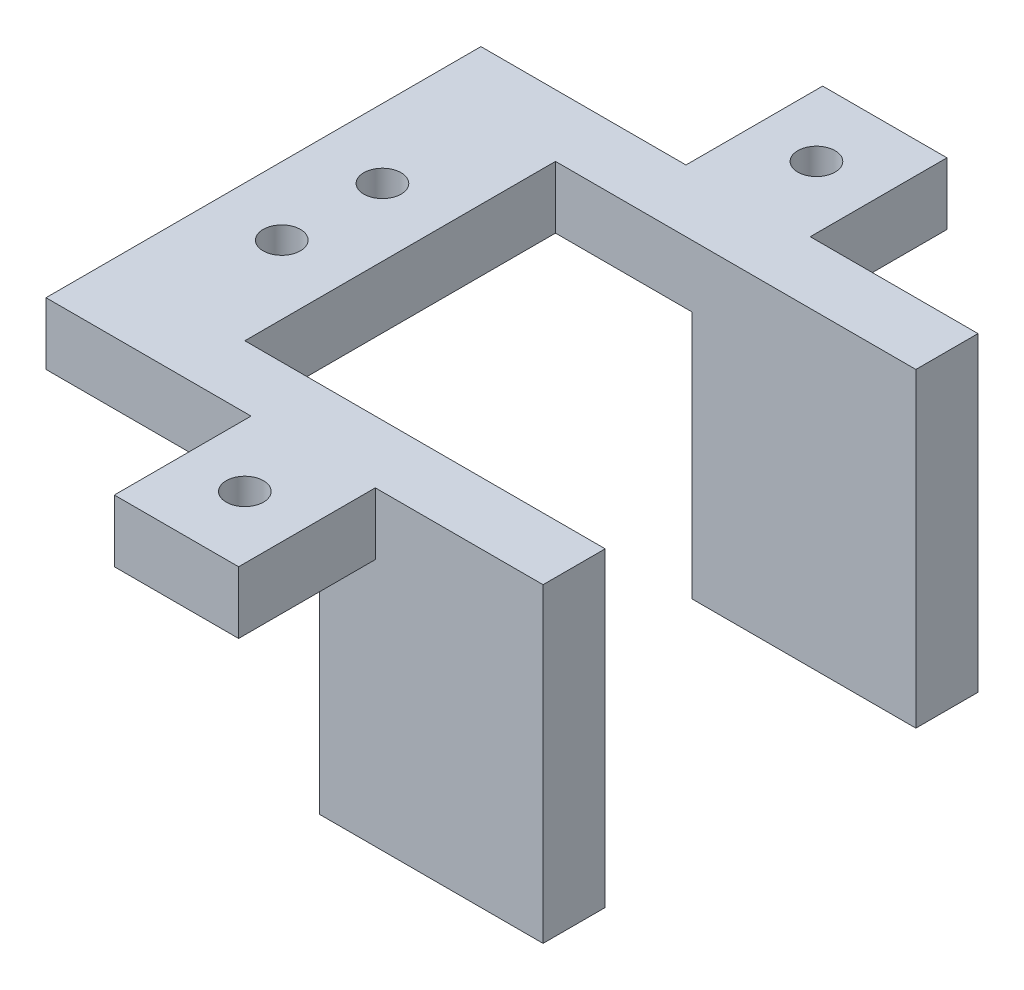
ISO-10303-21;
HEADER;
FILE_DESCRIPTION(('STEP AP214'),'2;1');
FILE_NAME('part.step','',(''),(''),'','','');
FILE_SCHEMA(('AUTOMOTIVE_DESIGN { 1 0 10303 214 1 1 1 1 }'));
ENDSEC;
DATA;
#1=APPLICATION_CONTEXT('core data for automotive mechanical design processes');
#2=APPLICATION_PROTOCOL_DEFINITION('international standard','automotive_design',2000,#1);
#3=PRODUCT_CONTEXT('',#1,'mechanical');
#4=PRODUCT('Part','Part','',(#3));
#5=PRODUCT_RELATED_PRODUCT_CATEGORY('part','',(#4));
#6=PRODUCT_DEFINITION_FORMATION('','',#4);
#7=PRODUCT_DEFINITION_CONTEXT('part definition',#1,'design');
#8=PRODUCT_DEFINITION('design','',#6,#7);
#9=PRODUCT_DEFINITION_SHAPE('','',#8);
#10=(LENGTH_UNIT() NAMED_UNIT(*) SI_UNIT(.MILLI.,.METRE.));
#11=(NAMED_UNIT(*) PLANE_ANGLE_UNIT() SI_UNIT($,.RADIAN.));
#12=(NAMED_UNIT(*) SI_UNIT($,.STERADIAN.) SOLID_ANGLE_UNIT());
#13=UNCERTAINTY_MEASURE_WITH_UNIT(LENGTH_MEASURE(1.E-05),#10,'distance_accuracy_value','');
#14=(GEOMETRIC_REPRESENTATION_CONTEXT(3) GLOBAL_UNCERTAINTY_ASSIGNED_CONTEXT((#13)) GLOBAL_UNIT_ASSIGNED_CONTEXT((#10,
#11,#12)) REPRESENTATION_CONTEXT('',''));
#15=CARTESIAN_POINT('',(0.,0.,0.));
#16=DIRECTION('',(0.,0.,1.));
#17=DIRECTION('',(1.,0.,0.));
#18=AXIS2_PLACEMENT_3D('',#15,#16,#17);
#19=CARTESIAN_POINT('',(0.,0.,-17.5));
#20=DIRECTION('',(0.,0.,-1.));
#21=DIRECTION('',(-1.,0.,0.));
#22=AXIS2_PLACEMENT_3D('',#19,#20,#21);
#23=PLANE('',#22);
#24=DIRECTION('',(-1.,0.,0.));
#25=VECTOR('',#24,1.);
#26=CARTESIAN_POINT('',(0.,0.,-17.5));
#27=LINE('',#26,#25);
#28=CARTESIAN_POINT('',(21.,0.,-17.5));
#29=VERTEX_POINT('',#28);
#30=CARTESIAN_POINT('',(16.5,0.,-17.5));
#31=VERTEX_POINT('',#30);
#32=EDGE_CURVE('E54',#29,#31,#27,.T.);
#33=ORIENTED_EDGE('',*,*,#32,.F.);
#34=DIRECTION('',(0.,-1.,0.));
#35=VECTOR('',#34,1.);
#36=CARTESIAN_POINT('',(21.,0.,-17.5));
#37=LINE('',#36,#35);
#38=CARTESIAN_POINT('',(21.,5.,-17.5));
#39=VERTEX_POINT('',#38);
#40=EDGE_CURVE('E196',#39,#29,#37,.T.);
#41=ORIENTED_EDGE('',*,*,#40,.F.);
#42=DIRECTION('',(1.,0.,0.));
#43=VECTOR('',#42,1.);
#44=CARTESIAN_POINT('',(-5.5,5.,-17.5));
#45=LINE('',#44,#43);
#46=CARTESIAN_POINT('',(34.5,5.,-17.5));
#47=VERTEX_POINT('',#46);
#48=EDGE_CURVE('E221',#39,#47,#45,.T.);
#49=ORIENTED_EDGE('',*,*,#48,.T.);
#50=DIRECTION('',(0.,-1.,0.));
#51=VECTOR('',#50,1.);
#52=CARTESIAN_POINT('',(34.5,5.,-17.5));
#53=LINE('',#52,#51);
#54=CARTESIAN_POINT('',(34.5,-20.,-17.5));
#55=VERTEX_POINT('',#54);
#56=EDGE_CURVE('E224',#47,#55,#53,.T.);
#57=ORIENTED_EDGE('',*,*,#56,.T.);
#58=DIRECTION('',(-1.,0.,0.));
#59=VECTOR('',#58,1.);
#60=CARTESIAN_POINT('',(34.5,-20.,-17.5));
#61=LINE('',#60,#59);
#62=CARTESIAN_POINT('',(16.5,-20.,-17.5));
#63=VERTEX_POINT('',#62);
#64=EDGE_CURVE('E227',#55,#63,#61,.T.);
#65=ORIENTED_EDGE('',*,*,#64,.T.);
#66=DIRECTION('',(0.,1.,0.));
#67=VECTOR('',#66,1.);
#68=CARTESIAN_POINT('',(16.5,-20.,-17.5));
#69=LINE('',#68,#67);
#70=EDGE_CURVE('E230',#63,#31,#69,.T.);
#71=ORIENTED_EDGE('',*,*,#70,.T.);
#72=EDGE_LOOP('',(#33,#41,#49,#57,#65,#71));
#73=FACE_BOUND('',#72,.T.);
#74=ADVANCED_FACE('F37',(#73),#23,.T.);
#75=CARTESIAN_POINT('',(16.5,-20.,-8.5));
#76=DIRECTION('',(1.,0.,0.));
#77=DIRECTION('',(0.,0.,-1.));
#78=AXIS2_PLACEMENT_3D('',#75,#76,#77);
#79=PLANE('',#78);
#80=DIRECTION('',(0.,-1.,0.));
#81=VECTOR('',#80,1.);
#82=CARTESIAN_POINT('',(16.5,0.,-12.5));
#83=LINE('',#82,#81);
#84=CARTESIAN_POINT('',(16.5,0.,-12.5));
#85=VERTEX_POINT('',#84);
#86=CARTESIAN_POINT('',(16.5,-20.,-12.5));
#87=VERTEX_POINT('',#86);
#88=EDGE_CURVE('E215',#85,#87,#83,.T.);
#89=ORIENTED_EDGE('',*,*,#88,.F.);
#90=DIRECTION('',(0.,0.,-1.));
#91=VECTOR('',#90,1.);
#92=CARTESIAN_POINT('',(16.5,0.,-8.5));
#93=LINE('',#92,#91);
#94=EDGE_CURVE('E320',#85,#31,#93,.T.);
#95=ORIENTED_EDGE('',*,*,#94,.T.);
#96=ORIENTED_EDGE('',*,*,#70,.F.);
#97=DIRECTION('',(0.,0.,-1.));
#98=VECTOR('',#97,1.);
#99=CARTESIAN_POINT('',(16.5,-20.,-8.5));
#100=LINE('',#99,#98);
#101=EDGE_CURVE('E322',#87,#63,#100,.T.);
#102=ORIENTED_EDGE('',*,*,#101,.F.);
#103=EDGE_LOOP('',(#89,#95,#96,#102));
#104=FACE_BOUND('',#103,.T.);
#105=ADVANCED_FACE('F364',(#104),#79,.F.);
#106=CARTESIAN_POINT('',(0.,-20.,0.));
#107=DIRECTION('',(0.,-1.,0.));
#108=DIRECTION('',(0.,0.,-1.));
#109=AXIS2_PLACEMENT_3D('',#106,#107,#108);
#110=PLANE('',#109);
#111=DIRECTION('',(0.,0.,-1.));
#112=VECTOR('',#111,1.);
#113=CARTESIAN_POINT('',(34.5,-20.,-8.5));
#114=LINE('',#113,#112);
#115=CARTESIAN_POINT('',(34.5,-20.,-12.5));
#116=VERTEX_POINT('',#115);
#117=EDGE_CURVE('E313',#116,#55,#114,.T.);
#118=ORIENTED_EDGE('',*,*,#117,.F.);
#119=DIRECTION('',(1.,0.,0.));
#120=VECTOR('',#119,1.);
#121=CARTESIAN_POINT('',(16.5,-20.,-12.5));
#122=LINE('',#121,#120);
#123=EDGE_CURVE('E217',#87,#116,#122,.T.);
#124=ORIENTED_EDGE('',*,*,#123,.F.);
#125=ORIENTED_EDGE('',*,*,#101,.T.);
#126=ORIENTED_EDGE('',*,*,#64,.F.);
#127=EDGE_LOOP('',(#118,#124,#125,#126));
#128=FACE_BOUND('',#127,.T.);
#129=ADVANCED_FACE('F370',(#128),#110,.T.);
#130=CARTESIAN_POINT('',(34.5,-20.,-8.5));
#131=DIRECTION('',(1.,0.,0.));
#132=DIRECTION('',(0.,0.,-1.));
#133=AXIS2_PLACEMENT_3D('',#130,#131,#132);
#134=PLANE('',#133);
#135=DIRECTION('',(0.,0.,-1.));
#136=VECTOR('',#135,1.);
#137=CARTESIAN_POINT('',(34.5,5.,-8.5));
#138=LINE('',#137,#136);
#139=CARTESIAN_POINT('',(34.5,5.,-12.5));
#140=VERTEX_POINT('',#139);
#141=EDGE_CURVE('E312',#140,#47,#138,.T.);
#142=ORIENTED_EDGE('',*,*,#141,.F.);
#143=DIRECTION('',(0.,1.,0.));
#144=VECTOR('',#143,1.);
#145=CARTESIAN_POINT('',(34.5,-20.,-12.5));
#146=LINE('',#145,#144);
#147=EDGE_CURVE('E219',#116,#140,#146,.T.);
#148=ORIENTED_EDGE('',*,*,#147,.F.);
#149=ORIENTED_EDGE('',*,*,#117,.T.);
#150=ORIENTED_EDGE('',*,*,#56,.F.);
#151=EDGE_LOOP('',(#142,#148,#149,#150));
#152=FACE_BOUND('',#151,.T.);
#153=ADVANCED_FACE('F378',(#152),#134,.T.);
#154=CARTESIAN_POINT('',(0.,0.,17.5));
#155=DIRECTION('',(0.,0.,1.));
#156=DIRECTION('',(1.,0.,0.));
#157=AXIS2_PLACEMENT_3D('',#154,#155,#156);
#158=PLANE('',#157);
#159=DIRECTION('',(0.,-1.,0.));
#160=VECTOR('',#159,1.);
#161=CARTESIAN_POINT('',(11.,0.,17.5));
#162=LINE('',#161,#160);
#163=CARTESIAN_POINT('',(11.,5.,17.5));
#164=VERTEX_POINT('',#163);
#165=CARTESIAN_POINT('',(11.,0.,17.5));
#166=VERTEX_POINT('',#165);
#167=EDGE_CURVE('E247',#164,#166,#162,.T.);
#168=ORIENTED_EDGE('',*,*,#167,.F.);
#169=DIRECTION('',(-1.,0.,0.));
#170=VECTOR('',#169,1.);
#171=CARTESIAN_POINT('',(34.5,5.,17.5));
#172=LINE('',#171,#170);
#173=CARTESIAN_POINT('',(-5.5,5.,17.5));
#174=VERTEX_POINT('',#173);
#175=EDGE_CURVE('E283',#164,#174,#172,.T.);
#176=ORIENTED_EDGE('',*,*,#175,.T.);
#177=DIRECTION('',(0.,-1.,0.));
#178=VECTOR('',#177,1.);
#179=CARTESIAN_POINT('',(-5.5,5.,17.5));
#180=LINE('',#179,#178);
#181=CARTESIAN_POINT('',(-5.5,0.,17.5));
#182=VERTEX_POINT('',#181);
#183=EDGE_CURVE('E286',#174,#182,#180,.T.);
#184=ORIENTED_EDGE('',*,*,#183,.T.);
#185=DIRECTION('',(1.,0.,0.));
#186=VECTOR('',#185,1.);
#187=CARTESIAN_POINT('',(-5.5,0.,17.5));
#188=LINE('',#187,#186);
#189=EDGE_CURVE('E289',#182,#166,#188,.T.);
#190=ORIENTED_EDGE('',*,*,#189,.T.);
#191=EDGE_LOOP('',(#168,#176,#184,#190));
#192=FACE_BOUND('',#191,.T.);
#193=ADVANCED_FACE('F417',(#192),#158,.T.);
#194=CARTESIAN_POINT('',(16.5,-20.,13.5));
#195=DIRECTION('',(1.,0.,0.));
#196=DIRECTION('',(0.,0.,-1.));
#197=AXIS2_PLACEMENT_3D('',#194,#195,#196);
#198=PLANE('',#197);
#199=DIRECTION('',(0.,1.,0.));
#200=VECTOR('',#199,1.);
#201=CARTESIAN_POINT('',(16.5,-20.,12.5));
#202=LINE('',#201,#200);
#203=CARTESIAN_POINT('',(16.5,-20.,12.5));
#204=VERTEX_POINT('',#203);
#205=CARTESIAN_POINT('',(16.5,0.,12.5));
#206=VERTEX_POINT('',#205);
#207=EDGE_CURVE('E275',#204,#206,#202,.T.);
#208=ORIENTED_EDGE('',*,*,#207,.F.);
#209=DIRECTION('',(0.,0.,-1.));
#210=VECTOR('',#209,1.);
#211=CARTESIAN_POINT('',(16.5,-20.,13.5));
#212=LINE('',#211,#210);
#213=CARTESIAN_POINT('',(16.5,-20.,17.5));
#214=VERTEX_POINT('',#213);
#215=EDGE_CURVE('E326',#214,#204,#212,.T.);
#216=ORIENTED_EDGE('',*,*,#215,.F.);
#217=DIRECTION('',(0.,-1.,0.));
#218=VECTOR('',#217,1.);
#219=CARTESIAN_POINT('',(16.5,0.,17.5));
#220=LINE('',#219,#218);
#221=CARTESIAN_POINT('',(16.5,0.,17.5));
#222=VERTEX_POINT('',#221);
#223=EDGE_CURVE('E291',#222,#214,#220,.T.);
#224=ORIENTED_EDGE('',*,*,#223,.F.);
#225=DIRECTION('',(0.,0.,-1.));
#226=VECTOR('',#225,1.);
#227=CARTESIAN_POINT('',(16.5,0.,13.5));
#228=LINE('',#227,#226);
#229=EDGE_CURVE('E324',#222,#206,#228,.T.);
#230=ORIENTED_EDGE('',*,*,#229,.T.);
#231=EDGE_LOOP('',(#208,#216,#224,#230));
#232=FACE_BOUND('',#231,.T.);
#233=ADVANCED_FACE('F401',(#232),#198,.F.);
#234=CARTESIAN_POINT('',(0.,-20.,0.));
#235=DIRECTION('',(0.,-1.,0.));
#236=DIRECTION('',(0.,0.,-1.));
#237=AXIS2_PLACEMENT_3D('',#234,#235,#236);
#238=PLANE('',#237);
#239=ORIENTED_EDGE('',*,*,#215,.T.);
#240=DIRECTION('',(-1.,0.,0.));
#241=VECTOR('',#240,1.);
#242=CARTESIAN_POINT('',(34.5,-20.,12.5));
#243=LINE('',#242,#241);
#244=CARTESIAN_POINT('',(34.5,-20.,12.5));
#245=VERTEX_POINT('',#244);
#246=EDGE_CURVE('E273',#245,#204,#243,.T.);
#247=ORIENTED_EDGE('',*,*,#246,.F.);
#248=DIRECTION('',(0.,0.,1.));
#249=VECTOR('',#248,1.);
#250=CARTESIAN_POINT('',(34.5,-20.,8.5));
#251=LINE('',#250,#249);
#252=CARTESIAN_POINT('',(34.5,-20.,17.5));
#253=VERTEX_POINT('',#252);
#254=EDGE_CURVE('E315',#245,#253,#251,.T.);
#255=ORIENTED_EDGE('',*,*,#254,.T.);
#256=DIRECTION('',(1.,0.,0.));
#257=VECTOR('',#256,1.);
#258=CARTESIAN_POINT('',(16.5,-20.,17.5));
#259=LINE('',#258,#257);
#260=EDGE_CURVE('E294',#214,#253,#259,.T.);
#261=ORIENTED_EDGE('',*,*,#260,.F.);
#262=EDGE_LOOP('',(#239,#247,#255,#261));
#263=FACE_BOUND('',#262,.T.);
#264=ADVANCED_FACE('F397',(#263),#238,.T.);
#265=CARTESIAN_POINT('',(34.5,-20.,8.5));
#266=DIRECTION('',(1.,0.,0.));
#267=DIRECTION('',(0.,0.,-1.));
#268=AXIS2_PLACEMENT_3D('',#265,#266,#267);
#269=PLANE('',#268);
#270=ORIENTED_EDGE('',*,*,#254,.F.);
#271=DIRECTION('',(0.,-1.,0.));
#272=VECTOR('',#271,1.);
#273=CARTESIAN_POINT('',(34.5,5.,12.5));
#274=LINE('',#273,#272);
#275=CARTESIAN_POINT('',(34.5,5.,12.5));
#276=VERTEX_POINT('',#275);
#277=EDGE_CURVE('E271',#276,#245,#274,.T.);
#278=ORIENTED_EDGE('',*,*,#277,.F.);
#279=DIRECTION('',(0.,0.,1.));
#280=VECTOR('',#279,1.);
#281=CARTESIAN_POINT('',(34.5,5.,8.5));
#282=LINE('',#281,#280);
#283=CARTESIAN_POINT('',(34.5,5.,17.5));
#284=VERTEX_POINT('',#283);
#285=EDGE_CURVE('E318',#276,#284,#282,.T.);
#286=ORIENTED_EDGE('',*,*,#285,.T.);
#287=DIRECTION('',(0.,1.,0.));
#288=VECTOR('',#287,1.);
#289=CARTESIAN_POINT('',(34.5,-20.,17.5));
#290=LINE('',#289,#288);
#291=EDGE_CURVE('E297',#253,#284,#290,.T.);
#292=ORIENTED_EDGE('',*,*,#291,.F.);
#293=EDGE_LOOP('',(#270,#278,#286,#292));
#294=FACE_BOUND('',#293,.T.);
#295=ADVANCED_FACE('F391',(#294),#269,.T.);
#296=CARTESIAN_POINT('',(0.,0.,0.));
#297=DIRECTION('',(0.,1.,0.));
#298=DIRECTION('',(0.,0.,1.));
#299=AXIS2_PLACEMENT_3D('',#296,#297,#298);
#300=PLANE('',#299);
#301=CARTESIAN_POINT('',(16.,0.,-23.));
#302=DIRECTION('',(0.,1.,0.));
#303=DIRECTION('',(0.,0.,1.));
#304=AXIS2_PLACEMENT_3D('',#301,#302,#303);
#305=CIRCLE('',#304,1.5);
#306=CARTESIAN_POINT('',(16.,0.,-21.5));
#307=VERTEX_POINT('',#306);
#308=EDGE_CURVE('E355',#307,#307,#305,.T.);
#309=ORIENTED_EDGE('',*,*,#308,.T.);
#310=EDGE_LOOP('',(#309));
#311=FACE_BOUND('',#310,.T.);
#312=CARTESIAN_POINT('',(16.,0.,23.));
#313=DIRECTION('',(0.,1.,0.));
#314=DIRECTION('',(0.,0.,1.));
#315=AXIS2_PLACEMENT_3D('',#312,#313,#314);
#316=CIRCLE('',#315,1.5);
#317=CARTESIAN_POINT('',(16.,0.,24.5));
#318=VERTEX_POINT('',#317);
#319=EDGE_CURVE('E239',#318,#318,#316,.T.);
#320=ORIENTED_EDGE('',*,*,#319,.T.);
#321=EDGE_LOOP('',(#320));
#322=FACE_BOUND('',#321,.T.);
#323=CARTESIAN_POINT('',(-0.0268741303224965,0.,4.00024075894849));
#324=DIRECTION('',(0.,1.,0.));
#325=DIRECTION('',(0.,0.,1.));
#326=AXIS2_PLACEMENT_3D('',#323,#324,#325);
#327=CIRCLE('',#326,1.5);
#328=CARTESIAN_POINT('',(-0.0268741303224965,0.,5.50024075894849));
#329=VERTEX_POINT('',#328);
#330=EDGE_CURVE('E309',#329,#329,#327,.T.);
#331=ORIENTED_EDGE('',*,*,#330,.T.);
#332=EDGE_LOOP('',(#331));
#333=FACE_BOUND('',#332,.T.);
#334=CARTESIAN_POINT('',(0.0725231157101173,0.,-4.00175422654102));
#335=DIRECTION('',(0.,1.,0.));
#336=DIRECTION('',(0.,0.,1.));
#337=AXIS2_PLACEMENT_3D('',#334,#335,#336);
#338=CIRCLE('',#337,1.5);
#339=CARTESIAN_POINT('',(0.0725231157101173,0.,-2.50175422654102));
#340=VERTEX_POINT('',#339);
#341=EDGE_CURVE('E304',#340,#340,#338,.T.);
#342=ORIENTED_EDGE('',*,*,#341,.T.);
#343=EDGE_LOOP('',(#342));
#344=FACE_BOUND('',#343,.T.);
#345=DIRECTION('',(1.,0.,0.));
#346=VECTOR('',#345,1.);
#347=CARTESIAN_POINT('',(5.5,0.,-12.5));
#348=LINE('',#347,#346);
#349=CARTESIAN_POINT('',(5.5,0.,-12.5));
#350=VERTEX_POINT('',#349);
#351=EDGE_CURVE('E213',#350,#85,#348,.T.);
#352=ORIENTED_EDGE('',*,*,#351,.F.);
#353=DIRECTION('',(0.,0.,1.));
#354=VECTOR('',#353,1.);
#355=CARTESIAN_POINT('',(5.5,0.,-8.5));
#356=LINE('',#355,#354);
#357=CARTESIAN_POINT('',(5.5,0.,12.5));
#358=VERTEX_POINT('',#357);
#359=EDGE_CURVE('E329',#350,#358,#356,.T.);
#360=ORIENTED_EDGE('',*,*,#359,.T.);
#361=DIRECTION('',(-1.,0.,0.));
#362=VECTOR('',#361,1.);
#363=CARTESIAN_POINT('',(16.5,0.,12.5));
#364=LINE('',#363,#362);
#365=EDGE_CURVE('E277',#206,#358,#364,.T.);
#366=ORIENTED_EDGE('',*,*,#365,.F.);
#367=ORIENTED_EDGE('',*,*,#229,.F.);
#368=DIRECTION('',(1.,0.,0.));
#369=VECTOR('',#368,1.);
#370=CARTESIAN_POINT('',(0.,0.,17.5));
#371=LINE('',#370,#369);
#372=CARTESIAN_POINT('',(21.,0.,17.5));
#373=VERTEX_POINT('',#372);
#374=EDGE_CURVE('E11',#222,#373,#371,.T.);
#375=ORIENTED_EDGE('',*,*,#374,.T.);
#376=DIRECTION('',(0.,0.,-1.));
#377=VECTOR('',#376,1.);
#378=CARTESIAN_POINT('',(21.,0.,28.5));
#379=LINE('',#378,#377);
#380=CARTESIAN_POINT('',(21.,0.,28.5));
#381=VERTEX_POINT('',#380);
#382=EDGE_CURVE('E266',#381,#373,#379,.T.);
#383=ORIENTED_EDGE('',*,*,#382,.F.);
#384=DIRECTION('',(1.,0.,0.));
#385=VECTOR('',#384,1.);
#386=CARTESIAN_POINT('',(0.,0.,28.5));
#387=LINE('',#386,#385);
#388=CARTESIAN_POINT('',(11.,0.,28.5));
#389=VERTEX_POINT('',#388);
#390=EDGE_CURVE('E243',#389,#381,#387,.T.);
#391=ORIENTED_EDGE('',*,*,#390,.F.);
#392=DIRECTION('',(0.,0.,-1.));
#393=VECTOR('',#392,1.);
#394=CARTESIAN_POINT('',(11.,0.,28.5));
#395=LINE('',#394,#393);
#396=EDGE_CURVE('E252',#389,#166,#395,.T.);
#397=ORIENTED_EDGE('',*,*,#396,.T.);
#398=ORIENTED_EDGE('',*,*,#189,.F.);
#399=DIRECTION('',(0.,0.,-1.));
#400=VECTOR('',#399,1.);
#401=CARTESIAN_POINT('',(-5.5,0.,3.));
#402=LINE('',#401,#400);
#403=CARTESIAN_POINT('',(-5.5,0.,-17.5));
#404=VERTEX_POINT('',#403);
#405=EDGE_CURVE('E41',#182,#404,#402,.T.);
#406=ORIENTED_EDGE('',*,*,#405,.T.);
#407=DIRECTION('',(-1.,0.,0.));
#408=VECTOR('',#407,1.);
#409=CARTESIAN_POINT('',(16.5,0.,-17.5));
#410=LINE('',#409,#408);
#411=CARTESIAN_POINT('',(11.,0.,-17.5));
#412=VERTEX_POINT('',#411);
#413=EDGE_CURVE('E201',#412,#404,#410,.T.);
#414=ORIENTED_EDGE('',*,*,#413,.F.);
#415=DIRECTION('',(0.,0.,1.));
#416=VECTOR('',#415,1.);
#417=CARTESIAN_POINT('',(11.,0.,-28.5));
#418=LINE('',#417,#416);
#419=CARTESIAN_POINT('',(11.,0.,-28.5));
#420=VERTEX_POINT('',#419);
#421=EDGE_CURVE('E181',#420,#412,#418,.T.);
#422=ORIENTED_EDGE('',*,*,#421,.F.);
#423=DIRECTION('',(-1.,0.,0.));
#424=VECTOR('',#423,1.);
#425=CARTESIAN_POINT('',(0.,0.,-28.5));
#426=LINE('',#425,#424);
#427=CARTESIAN_POINT('',(21.,0.,-28.5));
#428=VERTEX_POINT('',#427);
#429=EDGE_CURVE('E187',#428,#420,#426,.T.);
#430=ORIENTED_EDGE('',*,*,#429,.F.);
#431=DIRECTION('',(0.,0.,1.));
#432=VECTOR('',#431,1.);
#433=CARTESIAN_POINT('',(21.,0.,-28.5));
#434=LINE('',#433,#432);
#435=EDGE_CURVE('E351',#428,#29,#434,.T.);
#436=ORIENTED_EDGE('',*,*,#435,.T.);
#437=ORIENTED_EDGE('',*,*,#32,.T.);
#438=ORIENTED_EDGE('',*,*,#94,.F.);
#439=EDGE_LOOP('',(#352,#360,#366,#367,#375,#383,#391,#397,#398,#406,#414,#422,#430,#436,#437,#438));
#440=FACE_BOUND('',#439,.T.);
#441=ADVANCED_FACE('F199',(#311,#322,#333,#344,#440),#300,.F.);
#442=CARTESIAN_POINT('',(5.5,5.,-8.5));
#443=DIRECTION('',(1.,0.,0.));
#444=DIRECTION('',(0.,0.,-1.));
#445=AXIS2_PLACEMENT_3D('',#442,#443,#444);
#446=PLANE('',#445);
#447=ORIENTED_EDGE('',*,*,#359,.F.);
#448=DIRECTION('',(0.,-1.,0.));
#449=VECTOR('',#448,1.);
#450=CARTESIAN_POINT('',(5.5,5.,-12.5));
#451=LINE('',#450,#449);
#452=CARTESIAN_POINT('',(5.5,5.,-12.5));
#453=VERTEX_POINT('',#452);
#454=EDGE_CURVE('E205',#453,#350,#451,.T.);
#455=ORIENTED_EDGE('',*,*,#454,.F.);
#456=DIRECTION('',(0.,0.,-1.));
#457=VECTOR('',#456,1.);
#458=CARTESIAN_POINT('',(5.5,5.,8.5));
#459=LINE('',#458,#457);
#460=CARTESIAN_POINT('',(5.5,5.,12.5));
#461=VERTEX_POINT('',#460);
#462=EDGE_CURVE('E46',#461,#453,#459,.T.);
#463=ORIENTED_EDGE('',*,*,#462,.F.);
#464=DIRECTION('',(0.,1.,0.));
#465=VECTOR('',#464,1.);
#466=CARTESIAN_POINT('',(5.5,0.,12.5));
#467=LINE('',#466,#465);
#468=EDGE_CURVE('E280',#358,#461,#467,.T.);
#469=ORIENTED_EDGE('',*,*,#468,.F.);
#470=EDGE_LOOP('',(#447,#455,#463,#469));
#471=FACE_BOUND('',#470,.T.);
#472=ADVANCED_FACE('F39',(#471),#446,.T.);
#473=CARTESIAN_POINT('',(-5.5,5.,3.));
#474=DIRECTION('',(-1.,0.,0.));
#475=DIRECTION('',(0.,0.,1.));
#476=AXIS2_PLACEMENT_3D('',#473,#474,#475);
#477=PLANE('',#476);
#478=ORIENTED_EDGE('',*,*,#405,.F.);
#479=ORIENTED_EDGE('',*,*,#183,.F.);
#480=DIRECTION('',(0.,0.,1.));
#481=VECTOR('',#480,1.);
#482=CARTESIAN_POINT('',(-5.5,5.,3.));
#483=LINE('',#482,#481);
#484=CARTESIAN_POINT('',(-5.5,5.,-17.5));
#485=VERTEX_POINT('',#484);
#486=EDGE_CURVE('E332',#485,#174,#483,.T.);
#487=ORIENTED_EDGE('',*,*,#486,.F.);
#488=DIRECTION('',(0.,1.,0.));
#489=VECTOR('',#488,1.);
#490=CARTESIAN_POINT('',(-5.5,0.,-17.5));
#491=LINE('',#490,#489);
#492=EDGE_CURVE('E233',#404,#485,#491,.T.);
#493=ORIENTED_EDGE('',*,*,#492,.F.);
#494=EDGE_LOOP('',(#478,#479,#487,#493));
#495=FACE_BOUND('',#494,.T.);
#496=ADVANCED_FACE('F340',(#495),#477,.T.);
#497=CARTESIAN_POINT('',(0.,5.,0.));
#498=DIRECTION('',(0.,1.,0.));
#499=DIRECTION('',(0.,0.,1.));
#500=AXIS2_PLACEMENT_3D('',#497,#498,#499);
#501=PLANE('',#500);
#502=CARTESIAN_POINT('',(16.,5.,-23.));
#503=DIRECTION('',(0.,1.,0.));
#504=DIRECTION('',(0.,0.,1.));
#505=AXIS2_PLACEMENT_3D('',#502,#503,#504);
#506=CIRCLE('',#505,1.5);
#507=CARTESIAN_POINT('',(16.,5.,-21.5));
#508=VERTEX_POINT('',#507);
#509=EDGE_CURVE('E800',#508,#508,#506,.T.);
#510=ORIENTED_EDGE('',*,*,#509,.F.);
#511=EDGE_LOOP('',(#510));
#512=FACE_BOUND('',#511,.T.);
#513=ORIENTED_EDGE('',*,*,#462,.T.);
#514=DIRECTION('',(-1.,0.,0.));
#515=VECTOR('',#514,1.);
#516=CARTESIAN_POINT('',(34.5,5.,-12.5));
#517=LINE('',#516,#515);
#518=EDGE_CURVE('E202',#140,#453,#517,.T.);
#519=ORIENTED_EDGE('',*,*,#518,.F.);
#520=ORIENTED_EDGE('',*,*,#141,.T.);
#521=ORIENTED_EDGE('',*,*,#48,.F.);
#522=DIRECTION('',(0.,0.,1.));
#523=VECTOR('',#522,1.);
#524=CARTESIAN_POINT('',(21.,5.,-28.5));
#525=LINE('',#524,#523);
#526=CARTESIAN_POINT('',(21.,5.,-28.5));
#527=VERTEX_POINT('',#526);
#528=EDGE_CURVE('E207',#527,#39,#525,.T.);
#529=ORIENTED_EDGE('',*,*,#528,.F.);
#530=DIRECTION('',(1.,0.,0.));
#531=VECTOR('',#530,1.);
#532=CARTESIAN_POINT('',(0.,5.,-28.5));
#533=LINE('',#532,#531);
#534=CARTESIAN_POINT('',(11.,5.,-28.5));
#535=VERTEX_POINT('',#534);
#536=EDGE_CURVE('E186',#535,#527,#533,.T.);
#537=ORIENTED_EDGE('',*,*,#536,.F.);
#538=DIRECTION('',(0.,0.,1.));
#539=VECTOR('',#538,1.);
#540=CARTESIAN_POINT('',(11.,5.,-28.5));
#541=LINE('',#540,#539);
#542=CARTESIAN_POINT('',(11.,5.,-17.5));
#543=VERTEX_POINT('',#542);
#544=EDGE_CURVE('E183',#535,#543,#541,.T.);
#545=ORIENTED_EDGE('',*,*,#544,.T.);
#546=EDGE_CURVE('E222',#485,#543,#45,.T.);
#547=ORIENTED_EDGE('',*,*,#546,.F.);
#548=ORIENTED_EDGE('',*,*,#486,.T.);
#549=ORIENTED_EDGE('',*,*,#175,.F.);
#550=DIRECTION('',(0.,0.,-1.));
#551=VECTOR('',#550,1.);
#552=CARTESIAN_POINT('',(11.,5.,28.5));
#553=LINE('',#552,#551);
#554=CARTESIAN_POINT('',(11.,5.,28.5));
#555=VERTEX_POINT('',#554);
#556=EDGE_CURVE('E260',#555,#164,#553,.T.);
#557=ORIENTED_EDGE('',*,*,#556,.F.);
#558=DIRECTION('',(-1.,0.,0.));
#559=VECTOR('',#558,1.);
#560=CARTESIAN_POINT('',(0.,5.,28.5));
#561=LINE('',#560,#559);
#562=CARTESIAN_POINT('',(21.,5.,28.5));
#563=VERTEX_POINT('',#562);
#564=EDGE_CURVE('E249',#563,#555,#561,.T.);
#565=ORIENTED_EDGE('',*,*,#564,.F.);
#566=DIRECTION('',(0.,0.,-1.));
#567=VECTOR('',#566,1.);
#568=CARTESIAN_POINT('',(21.,5.,28.5));
#569=LINE('',#568,#567);
#570=CARTESIAN_POINT('',(21.,5.,17.5));
#571=VERTEX_POINT('',#570);
#572=EDGE_CURVE('E263',#563,#571,#569,.T.);
#573=ORIENTED_EDGE('',*,*,#572,.T.);
#574=EDGE_CURVE('E284',#284,#571,#172,.T.);
#575=ORIENTED_EDGE('',*,*,#574,.F.);
#576=ORIENTED_EDGE('',*,*,#285,.F.);
#577=DIRECTION('',(1.,0.,0.));
#578=VECTOR('',#577,1.);
#579=CARTESIAN_POINT('',(5.5,5.,12.5));
#580=LINE('',#579,#578);
#581=EDGE_CURVE('E269',#461,#276,#580,.T.);
#582=ORIENTED_EDGE('',*,*,#581,.F.);
#583=EDGE_LOOP('',(#513,#519,#520,#521,#529,#537,#545,#547,#548,#549,#557,#565,#573,#575,#576,#582));
#584=FACE_BOUND('',#583,.T.);
#585=CARTESIAN_POINT('',(16.,5.,23.));
#586=DIRECTION('',(0.,1.,0.));
#587=DIRECTION('',(0.,0.,1.));
#588=AXIS2_PLACEMENT_3D('',#585,#586,#587);
#589=CIRCLE('',#588,1.5);
#590=CARTESIAN_POINT('',(16.,5.,24.5));
#591=VERTEX_POINT('',#590);
#592=EDGE_CURVE('E236',#591,#591,#589,.T.);
#593=ORIENTED_EDGE('',*,*,#592,.F.);
#594=EDGE_LOOP('',(#593));
#595=FACE_BOUND('',#594,.T.);
#596=CARTESIAN_POINT('',(-0.0268741303224965,5.,4.00024075894849));
#597=DIRECTION('',(0.,1.,0.));
#598=DIRECTION('',(0.,0.,1.));
#599=AXIS2_PLACEMENT_3D('',#596,#597,#598);
#600=CIRCLE('',#599,1.5);
#601=CARTESIAN_POINT('',(-0.0268741303224965,5.,5.50024075894849));
#602=VERTEX_POINT('',#601);
#603=EDGE_CURVE('E301',#602,#602,#600,.T.);
#604=ORIENTED_EDGE('',*,*,#603,.F.);
#605=EDGE_LOOP('',(#604));
#606=FACE_BOUND('',#605,.T.);
#607=CARTESIAN_POINT('',(0.0725231157101173,5.,-4.00175422654102));
#608=DIRECTION('',(0.,1.,0.));
#609=DIRECTION('',(0.,0.,1.));
#610=AXIS2_PLACEMENT_3D('',#607,#608,#609);
#611=CIRCLE('',#610,1.5);
#612=CARTESIAN_POINT('',(0.0725231157101173,5.,-2.50175422654102));
#613=VERTEX_POINT('',#612);
#614=EDGE_CURVE('E300',#613,#613,#611,.T.);
#615=ORIENTED_EDGE('',*,*,#614,.F.);
#616=EDGE_LOOP('',(#615));
#617=FACE_BOUND('',#616,.T.);
#618=ADVANCED_FACE('F344',(#512,#584,#595,#606,#617),#501,.T.);
#619=CARTESIAN_POINT('',(0.0725231157101173,-5.,-4.00175422654102));
#620=DIRECTION('',(0.,1.,0.));
#621=DIRECTION('',(0.,0.,1.));
#622=AXIS2_PLACEMENT_3D('',#619,#620,#621);
#623=CYLINDRICAL_SURFACE('',#622,1.5);
#624=ORIENTED_EDGE('',*,*,#614,.T.);
#625=EDGE_LOOP('',(#624));
#626=FACE_BOUND('',#625,.T.);
#627=ORIENTED_EDGE('',*,*,#341,.F.);
#628=EDGE_LOOP('',(#627));
#629=FACE_BOUND('',#628,.T.);
#630=ADVANCED_FACE('F558',(#626,#629),#623,.F.);
#631=CARTESIAN_POINT('',(-0.0268741303224965,-5.,4.00024075894849));
#632=DIRECTION('',(0.,1.,0.));
#633=DIRECTION('',(0.,0.,1.));
#634=AXIS2_PLACEMENT_3D('',#631,#632,#633);
#635=CYLINDRICAL_SURFACE('',#634,1.5);
#636=ORIENTED_EDGE('',*,*,#603,.T.);
#637=EDGE_LOOP('',(#636));
#638=FACE_BOUND('',#637,.T.);
#639=ORIENTED_EDGE('',*,*,#330,.F.);
#640=EDGE_LOOP('',(#639));
#641=FACE_BOUND('',#640,.T.);
#642=ADVANCED_FACE('F429',(#638,#641),#635,.F.);
#643=ORIENTED_EDGE('',*,*,#374,.F.);
#644=ORIENTED_EDGE('',*,*,#223,.T.);
#645=ORIENTED_EDGE('',*,*,#260,.T.);
#646=ORIENTED_EDGE('',*,*,#291,.T.);
#647=ORIENTED_EDGE('',*,*,#574,.T.);
#648=DIRECTION('',(0.,1.,0.));
#649=VECTOR('',#648,1.);
#650=CARTESIAN_POINT('',(21.,0.,17.5));
#651=LINE('',#650,#649);
#652=EDGE_CURVE('E242',#373,#571,#651,.T.);
#653=ORIENTED_EDGE('',*,*,#652,.F.);
#654=EDGE_LOOP('',(#643,#644,#645,#646,#647,#653));
#655=FACE_BOUND('',#654,.T.);
#656=ADVANCED_FACE('F393',(#655),#158,.T.);
#657=CARTESIAN_POINT('',(0.,0.,12.5));
#658=DIRECTION('',(0.,0.,-1.));
#659=DIRECTION('',(-1.,0.,0.));
#660=AXIS2_PLACEMENT_3D('',#657,#658,#659);
#661=PLANE('',#660);
#662=ORIENTED_EDGE('',*,*,#581,.T.);
#663=ORIENTED_EDGE('',*,*,#277,.T.);
#664=ORIENTED_EDGE('',*,*,#246,.T.);
#665=ORIENTED_EDGE('',*,*,#207,.T.);
#666=ORIENTED_EDGE('',*,*,#365,.T.);
#667=ORIENTED_EDGE('',*,*,#468,.T.);
#668=EDGE_LOOP('',(#662,#663,#664,#665,#666,#667));
#669=FACE_BOUND('',#668,.T.);
#670=ADVANCED_FACE('F384',(#669),#661,.T.);
#671=CARTESIAN_POINT('',(21.,0.,28.5));
#672=DIRECTION('',(-1.,0.,0.));
#673=DIRECTION('',(0.,0.,1.));
#674=AXIS2_PLACEMENT_3D('',#671,#672,#673);
#675=PLANE('',#674);
#676=ORIENTED_EDGE('',*,*,#652,.T.);
#677=ORIENTED_EDGE('',*,*,#572,.F.);
#678=DIRECTION('',(0.,1.,0.));
#679=VECTOR('',#678,1.);
#680=CARTESIAN_POINT('',(21.,0.,28.5));
#681=LINE('',#680,#679);
#682=EDGE_CURVE('E246',#381,#563,#681,.T.);
#683=ORIENTED_EDGE('',*,*,#682,.F.);
#684=ORIENTED_EDGE('',*,*,#382,.T.);
#685=EDGE_LOOP('',(#676,#677,#683,#684));
#686=FACE_BOUND('',#685,.T.);
#687=ADVANCED_FACE('F406',(#686),#675,.F.);
#688=CARTESIAN_POINT('',(11.,0.,28.5));
#689=DIRECTION('',(1.,0.,0.));
#690=DIRECTION('',(0.,0.,-1.));
#691=AXIS2_PLACEMENT_3D('',#688,#689,#690);
#692=PLANE('',#691);
#693=ORIENTED_EDGE('',*,*,#167,.T.);
#694=ORIENTED_EDGE('',*,*,#396,.F.);
#695=DIRECTION('',(0.,-1.,0.));
#696=VECTOR('',#695,1.);
#697=CARTESIAN_POINT('',(11.,0.,28.5));
#698=LINE('',#697,#696);
#699=EDGE_CURVE('E251',#555,#389,#698,.T.);
#700=ORIENTED_EDGE('',*,*,#699,.F.);
#701=ORIENTED_EDGE('',*,*,#556,.T.);
#702=EDGE_LOOP('',(#693,#694,#700,#701));
#703=FACE_BOUND('',#702,.T.);
#704=ADVANCED_FACE('F414',(#703),#692,.F.);
#705=CARTESIAN_POINT('',(0.,0.,28.5));
#706=DIRECTION('',(0.,0.,1.));
#707=DIRECTION('',(1.,0.,0.));
#708=AXIS2_PLACEMENT_3D('',#705,#706,#707);
#709=PLANE('',#708);
#710=ORIENTED_EDGE('',*,*,#390,.T.);
#711=ORIENTED_EDGE('',*,*,#682,.T.);
#712=ORIENTED_EDGE('',*,*,#564,.T.);
#713=ORIENTED_EDGE('',*,*,#699,.T.);
#714=EDGE_LOOP('',(#710,#711,#712,#713));
#715=FACE_BOUND('',#714,.T.);
#716=ADVANCED_FACE('F410',(#715),#709,.T.);
#717=CARTESIAN_POINT('',(16.,-5.,23.));
#718=DIRECTION('',(0.,1.,0.));
#719=DIRECTION('',(0.,0.,1.));
#720=AXIS2_PLACEMENT_3D('',#717,#718,#719);
#721=CYLINDRICAL_SURFACE('',#720,1.5);
#722=ORIENTED_EDGE('',*,*,#592,.T.);
#723=EDGE_LOOP('',(#722));
#724=FACE_BOUND('',#723,.T.);
#725=ORIENTED_EDGE('',*,*,#319,.F.);
#726=EDGE_LOOP('',(#725));
#727=FACE_BOUND('',#726,.T.);
#728=ADVANCED_FACE('F440',(#724,#727),#721,.F.);
#729=DIRECTION('',(0.,1.,0.));
#730=VECTOR('',#729,1.);
#731=CARTESIAN_POINT('',(11.,0.,-17.5));
#732=LINE('',#731,#730);
#733=EDGE_CURVE('E62',#412,#543,#732,.T.);
#734=ORIENTED_EDGE('',*,*,#733,.F.);
#735=ORIENTED_EDGE('',*,*,#413,.T.);
#736=ORIENTED_EDGE('',*,*,#492,.T.);
#737=ORIENTED_EDGE('',*,*,#546,.T.);
#738=EDGE_LOOP('',(#734,#735,#736,#737));
#739=FACE_BOUND('',#738,.T.);
#740=ADVANCED_FACE('F342',(#739),#23,.T.);
#741=CARTESIAN_POINT('',(0.,0.,-12.5));
#742=DIRECTION('',(0.,0.,1.));
#743=DIRECTION('',(1.,0.,0.));
#744=AXIS2_PLACEMENT_3D('',#741,#742,#743);
#745=PLANE('',#744);
#746=ORIENTED_EDGE('',*,*,#518,.T.);
#747=ORIENTED_EDGE('',*,*,#454,.T.);
#748=ORIENTED_EDGE('',*,*,#351,.T.);
#749=ORIENTED_EDGE('',*,*,#88,.T.);
#750=ORIENTED_EDGE('',*,*,#123,.T.);
#751=ORIENTED_EDGE('',*,*,#147,.T.);
#752=EDGE_LOOP('',(#746,#747,#748,#749,#750,#751));
#753=FACE_BOUND('',#752,.T.);
#754=ADVANCED_FACE('F374',(#753),#745,.T.);
#755=CARTESIAN_POINT('',(11.,0.,-28.5));
#756=DIRECTION('',(1.,0.,0.));
#757=DIRECTION('',(0.,0.,-1.));
#758=AXIS2_PLACEMENT_3D('',#755,#756,#757);
#759=PLANE('',#758);
#760=ORIENTED_EDGE('',*,*,#733,.T.);
#761=ORIENTED_EDGE('',*,*,#544,.F.);
#762=DIRECTION('',(0.,1.,0.));
#763=VECTOR('',#762,1.);
#764=CARTESIAN_POINT('',(11.,0.,-28.5));
#765=LINE('',#764,#763);
#766=EDGE_CURVE('E177',#420,#535,#765,.T.);
#767=ORIENTED_EDGE('',*,*,#766,.F.);
#768=ORIENTED_EDGE('',*,*,#421,.T.);
#769=EDGE_LOOP('',(#760,#761,#767,#768));
#770=FACE_BOUND('',#769,.T.);
#771=ADVANCED_FACE('F179',(#770),#759,.F.);
#772=CARTESIAN_POINT('',(21.,0.,-28.5));
#773=DIRECTION('',(-1.,0.,0.));
#774=DIRECTION('',(0.,0.,1.));
#775=AXIS2_PLACEMENT_3D('',#772,#773,#774);
#776=PLANE('',#775);
#777=ORIENTED_EDGE('',*,*,#40,.T.);
#778=ORIENTED_EDGE('',*,*,#435,.F.);
#779=DIRECTION('',(0.,-1.,0.));
#780=VECTOR('',#779,1.);
#781=CARTESIAN_POINT('',(21.,0.,-28.5));
#782=LINE('',#781,#780);
#783=EDGE_CURVE('E192',#527,#428,#782,.T.);
#784=ORIENTED_EDGE('',*,*,#783,.F.);
#785=ORIENTED_EDGE('',*,*,#528,.T.);
#786=EDGE_LOOP('',(#777,#778,#784,#785));
#787=FACE_BOUND('',#786,.T.);
#788=ADVANCED_FACE('F359',(#787),#776,.F.);
#789=CARTESIAN_POINT('',(0.,0.,-28.5));
#790=DIRECTION('',(0.,0.,-1.));
#791=DIRECTION('',(-1.,0.,0.));
#792=AXIS2_PLACEMENT_3D('',#789,#790,#791);
#793=PLANE('',#792);
#794=ORIENTED_EDGE('',*,*,#429,.T.);
#795=ORIENTED_EDGE('',*,*,#766,.T.);
#796=ORIENTED_EDGE('',*,*,#536,.T.);
#797=ORIENTED_EDGE('',*,*,#783,.T.);
#798=EDGE_LOOP('',(#794,#795,#796,#797));
#799=FACE_BOUND('',#798,.T.);
#800=ADVANCED_FACE('F190',(#799),#793,.T.);
#801=CARTESIAN_POINT('',(16.,-6.,-23.));
#802=DIRECTION('',(0.,1.,0.));
#803=DIRECTION('',(0.,0.,1.));
#804=AXIS2_PLACEMENT_3D('',#801,#802,#803);
#805=CYLINDRICAL_SURFACE('',#804,1.5);
#806=ORIENTED_EDGE('',*,*,#509,.T.);
#807=EDGE_LOOP('',(#806));
#808=FACE_BOUND('',#807,.T.);
#809=ORIENTED_EDGE('',*,*,#308,.F.);
#810=EDGE_LOOP('',(#809));
#811=FACE_BOUND('',#810,.T.);
#812=ADVANCED_FACE('F542',(#808,#811),#805,.F.);
#813=CLOSED_SHELL('',(#74,#105,#129,#153,#193,#233,#264,#295,#441,#472,#496,#618,#630,#642,#656,
#670,#687,#704,#716,#728,#740,#754,#771,#788,#800,#812));
#814=MANIFOLD_SOLID_BREP('B2',#813);
#815=ADVANCED_BREP_SHAPE_REPRESENTATION('',(#18,#814),#14);
#816=SHAPE_DEFINITION_REPRESENTATION(#9,#815);
ENDSEC;
END-ISO-10303-21;
